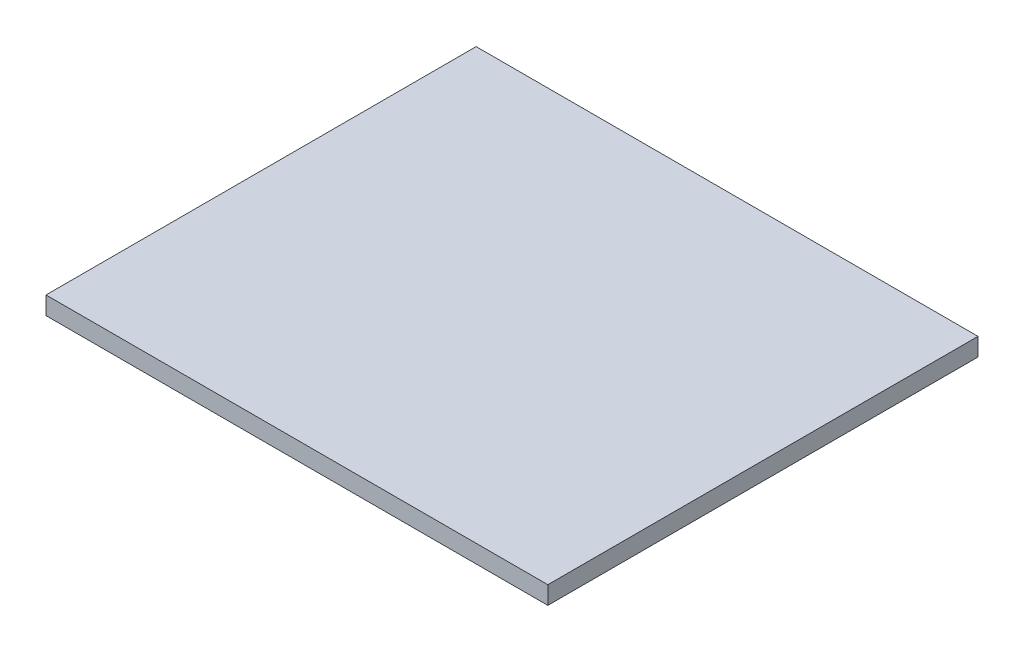
ISO-10303-21;
HEADER;
FILE_DESCRIPTION(('STEP AP214'),'2;1');
FILE_NAME('part.step','',(''),(''),'','','');
FILE_SCHEMA(('AUTOMOTIVE_DESIGN { 1 0 10303 214 1 1 1 1 }'));
ENDSEC;
DATA;
#1=APPLICATION_CONTEXT('core data for automotive mechanical design processes');
#2=APPLICATION_PROTOCOL_DEFINITION('international standard','automotive_design',2000,#1);
#3=PRODUCT_CONTEXT('',#1,'mechanical');
#4=PRODUCT('Part','Part','',(#3));
#5=PRODUCT_RELATED_PRODUCT_CATEGORY('part','',(#4));
#6=PRODUCT_DEFINITION_FORMATION('','',#4);
#7=PRODUCT_DEFINITION_CONTEXT('part definition',#1,'design');
#8=PRODUCT_DEFINITION('design','',#6,#7);
#9=PRODUCT_DEFINITION_SHAPE('','',#8);
#10=(LENGTH_UNIT() NAMED_UNIT(*) SI_UNIT(.MILLI.,.METRE.));
#11=(NAMED_UNIT(*) PLANE_ANGLE_UNIT() SI_UNIT($,.RADIAN.));
#12=(NAMED_UNIT(*) SI_UNIT($,.STERADIAN.) SOLID_ANGLE_UNIT());
#13=UNCERTAINTY_MEASURE_WITH_UNIT(LENGTH_MEASURE(1.E-05),#10,'distance_accuracy_value','');
#14=(GEOMETRIC_REPRESENTATION_CONTEXT(3) GLOBAL_UNCERTAINTY_ASSIGNED_CONTEXT((#13)) GLOBAL_UNIT_ASSIGNED_CONTEXT((#10,
#11,#12)) REPRESENTATION_CONTEXT('',''));
#15=CARTESIAN_POINT('',(0.,0.,0.));
#16=DIRECTION('',(0.,0.,1.));
#17=DIRECTION('',(1.,0.,0.));
#18=AXIS2_PLACEMENT_3D('',#15,#16,#17);
#19=CARTESIAN_POINT('',(88.9,6.35,76.2));
#20=DIRECTION('',(-1.,0.,0.));
#21=DIRECTION('',(0.,0.,1.));
#22=AXIS2_PLACEMENT_3D('',#19,#20,#21);
#23=PLANE('',#22);
#24=DIRECTION('',(0.,0.,-1.));
#25=VECTOR('',#24,1.);
#26=CARTESIAN_POINT('',(88.9,0.,76.2));
#27=LINE('',#26,#25);
#28=CARTESIAN_POINT('',(88.9,0.,76.2));
#29=VERTEX_POINT('',#28);
#30=CARTESIAN_POINT('',(88.9,0.,-76.2));
#31=VERTEX_POINT('',#30);
#32=EDGE_CURVE('E96',#29,#31,#27,.T.);
#33=ORIENTED_EDGE('',*,*,#32,.T.);
#34=DIRECTION('',(0.,-1.,0.));
#35=VECTOR('',#34,1.);
#36=CARTESIAN_POINT('',(88.9,6.35,-76.2));
#37=LINE('',#36,#35);
#38=CARTESIAN_POINT('',(88.9,6.35,-76.2));
#39=VERTEX_POINT('',#38);
#40=EDGE_CURVE('E11',#39,#31,#37,.T.);
#41=ORIENTED_EDGE('',*,*,#40,.F.);
#42=DIRECTION('',(0.,0.,-1.));
#43=VECTOR('',#42,1.);
#44=CARTESIAN_POINT('',(88.9,6.35,76.2));
#45=LINE('',#44,#43);
#46=CARTESIAN_POINT('',(88.9,6.35,76.2));
#47=VERTEX_POINT('',#46);
#48=EDGE_CURVE('E84',#47,#39,#45,.T.);
#49=ORIENTED_EDGE('',*,*,#48,.F.);
#50=DIRECTION('',(0.,-1.,0.));
#51=VECTOR('',#50,1.);
#52=CARTESIAN_POINT('',(88.9,6.35,76.2));
#53=LINE('',#52,#51);
#54=EDGE_CURVE('E92',#47,#29,#53,.T.);
#55=ORIENTED_EDGE('',*,*,#54,.T.);
#56=EDGE_LOOP('',(#33,#41,#49,#55));
#57=FACE_BOUND('',#56,.T.);
#58=ADVANCED_FACE('F33',(#57),#23,.F.);
#59=CARTESIAN_POINT('',(-88.9,6.35,-76.2));
#60=DIRECTION('',(0.,0.,1.));
#61=DIRECTION('',(1.,0.,0.));
#62=AXIS2_PLACEMENT_3D('',#59,#60,#61);
#63=PLANE('',#62);
#64=DIRECTION('',(-1.,0.,0.));
#65=VECTOR('',#64,1.);
#66=CARTESIAN_POINT('',(-88.9,0.,-76.2));
#67=LINE('',#66,#65);
#68=CARTESIAN_POINT('',(-88.9,0.,-76.2));
#69=VERTEX_POINT('',#68);
#70=EDGE_CURVE('E88',#31,#69,#67,.T.);
#71=ORIENTED_EDGE('',*,*,#70,.T.);
#72=DIRECTION('',(0.,-1.,0.));
#73=VECTOR('',#72,1.);
#74=CARTESIAN_POINT('',(-88.9,6.35,-76.2));
#75=LINE('',#74,#73);
#76=CARTESIAN_POINT('',(-88.9,6.35,-76.2));
#77=VERTEX_POINT('',#76);
#78=EDGE_CURVE('E41',#77,#69,#75,.T.);
#79=ORIENTED_EDGE('',*,*,#78,.F.);
#80=DIRECTION('',(-1.,0.,0.));
#81=VECTOR('',#80,1.);
#82=CARTESIAN_POINT('',(-88.9,6.35,-76.2));
#83=LINE('',#82,#81);
#84=EDGE_CURVE('E79',#39,#77,#83,.T.);
#85=ORIENTED_EDGE('',*,*,#84,.F.);
#86=ORIENTED_EDGE('',*,*,#40,.T.);
#87=EDGE_LOOP('',(#71,#79,#85,#86));
#88=FACE_BOUND('',#87,.T.);
#89=ADVANCED_FACE('F87',(#88),#63,.F.);
#90=CARTESIAN_POINT('',(-88.9,6.35,76.2));
#91=DIRECTION('',(1.,0.,0.));
#92=DIRECTION('',(0.,0.,-1.));
#93=AXIS2_PLACEMENT_3D('',#90,#91,#92);
#94=PLANE('',#93);
#95=DIRECTION('',(0.,0.,1.));
#96=VECTOR('',#95,1.);
#97=CARTESIAN_POINT('',(-88.9,0.,76.2));
#98=LINE('',#97,#96);
#99=CARTESIAN_POINT('',(-88.9,0.,76.2));
#100=VERTEX_POINT('',#99);
#101=EDGE_CURVE('E66',#69,#100,#98,.T.);
#102=ORIENTED_EDGE('',*,*,#101,.T.);
#103=DIRECTION('',(0.,-1.,0.));
#104=VECTOR('',#103,1.);
#105=CARTESIAN_POINT('',(-88.9,6.35,76.2));
#106=LINE('',#105,#104);
#107=CARTESIAN_POINT('',(-88.9,6.35,76.2));
#108=VERTEX_POINT('',#107);
#109=EDGE_CURVE('E89',#108,#100,#106,.T.);
#110=ORIENTED_EDGE('',*,*,#109,.F.);
#111=DIRECTION('',(0.,0.,1.));
#112=VECTOR('',#111,1.);
#113=CARTESIAN_POINT('',(-88.9,6.35,76.2));
#114=LINE('',#113,#112);
#115=EDGE_CURVE('E82',#77,#108,#114,.T.);
#116=ORIENTED_EDGE('',*,*,#115,.F.);
#117=ORIENTED_EDGE('',*,*,#78,.T.);
#118=EDGE_LOOP('',(#102,#110,#116,#117));
#119=FACE_BOUND('',#118,.T.);
#120=ADVANCED_FACE('F90',(#119),#94,.F.);
#121=CARTESIAN_POINT('',(-88.9,6.35,76.2));
#122=DIRECTION('',(0.,0.,-1.));
#123=DIRECTION('',(-1.,0.,0.));
#124=AXIS2_PLACEMENT_3D('',#121,#122,#123);
#125=PLANE('',#124);
#126=DIRECTION('',(1.,0.,0.));
#127=VECTOR('',#126,1.);
#128=CARTESIAN_POINT('',(-88.9,0.,76.2));
#129=LINE('',#128,#127);
#130=EDGE_CURVE('E72',#100,#29,#129,.T.);
#131=ORIENTED_EDGE('',*,*,#130,.T.);
#132=ORIENTED_EDGE('',*,*,#54,.F.);
#133=DIRECTION('',(1.,0.,0.));
#134=VECTOR('',#133,1.);
#135=CARTESIAN_POINT('',(-88.9,6.35,76.2));
#136=LINE('',#135,#134);
#137=EDGE_CURVE('E49',#108,#47,#136,.T.);
#138=ORIENTED_EDGE('',*,*,#137,.F.);
#139=ORIENTED_EDGE('',*,*,#109,.T.);
#140=EDGE_LOOP('',(#131,#132,#138,#139));
#141=FACE_BOUND('',#140,.T.);
#142=ADVANCED_FACE('F103',(#141),#125,.F.);
#143=CARTESIAN_POINT('',(0.,6.35,0.));
#144=DIRECTION('',(0.,-1.,0.));
#145=DIRECTION('',(0.,0.,-1.));
#146=AXIS2_PLACEMENT_3D('',#143,#144,#145);
#147=PLANE('',#146);
#148=ORIENTED_EDGE('',*,*,#48,.T.);
#149=ORIENTED_EDGE('',*,*,#84,.T.);
#150=ORIENTED_EDGE('',*,*,#115,.T.);
#151=ORIENTED_EDGE('',*,*,#137,.T.);
#152=EDGE_LOOP('',(#148,#149,#150,#151));
#153=FACE_BOUND('',#152,.T.);
#154=ADVANCED_FACE('F80',(#153),#147,.F.);
#155=CARTESIAN_POINT('',(0.,0.,0.));
#156=DIRECTION('',(0.,-1.,0.));
#157=DIRECTION('',(0.,0.,-1.));
#158=AXIS2_PLACEMENT_3D('',#155,#156,#157);
#159=PLANE('',#158);
#160=ORIENTED_EDGE('',*,*,#32,.F.);
#161=ORIENTED_EDGE('',*,*,#130,.F.);
#162=ORIENTED_EDGE('',*,*,#101,.F.);
#163=ORIENTED_EDGE('',*,*,#70,.F.);
#164=EDGE_LOOP('',(#160,#161,#162,#163));
#165=FACE_BOUND('',#164,.T.);
#166=ADVANCED_FACE('F106',(#165),#159,.T.);
#167=CLOSED_SHELL('',(#58,#89,#120,#142,#154,#166));
#168=MANIFOLD_SOLID_BREP('B2',#167);
#169=ADVANCED_BREP_SHAPE_REPRESENTATION('',(#18,#168),#14);
#170=SHAPE_DEFINITION_REPRESENTATION(#9,#169);
ENDSEC;
END-ISO-10303-21;
